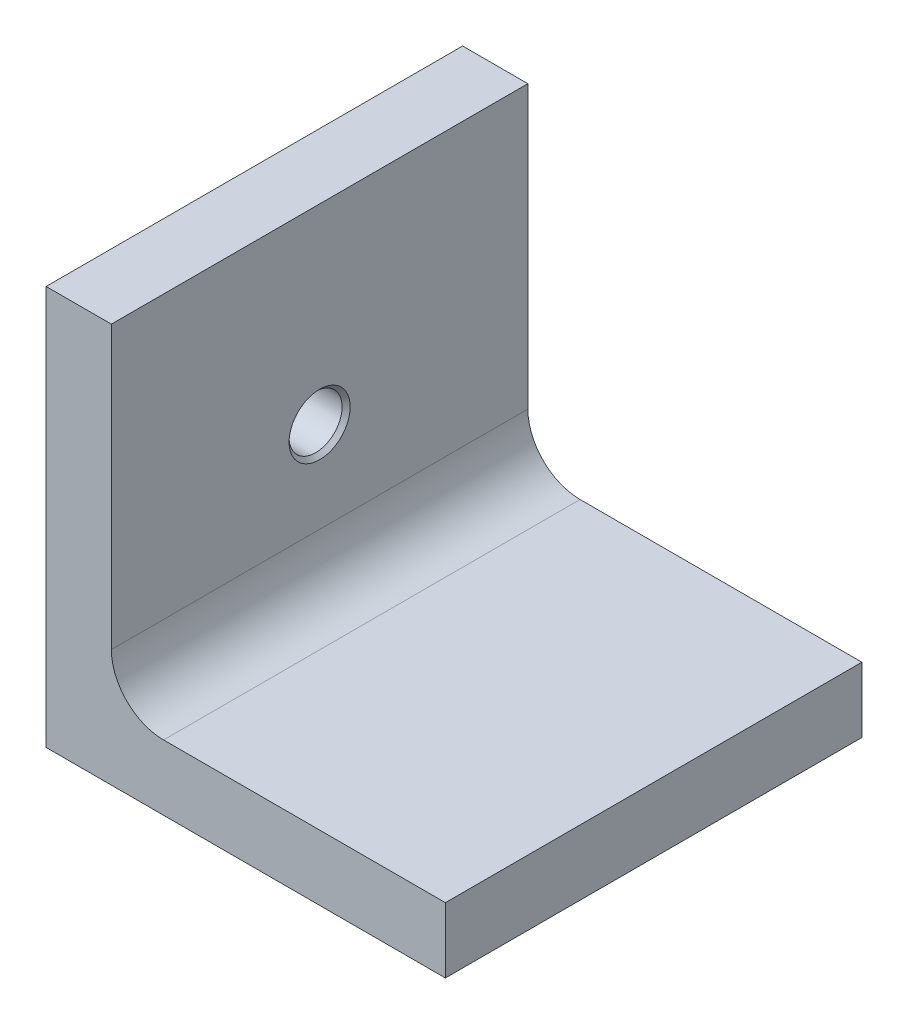
ISO-10303-21;
HEADER;
FILE_DESCRIPTION(('STEP AP214'),'2;1');
FILE_NAME('part.step','',(''),(''),'','','');
FILE_SCHEMA(('AUTOMOTIVE_DESIGN { 1 0 10303 214 1 1 1 1 }'));
ENDSEC;
DATA;
#1=APPLICATION_CONTEXT('core data for automotive mechanical design processes');
#2=APPLICATION_PROTOCOL_DEFINITION('international standard','automotive_design',2000,#1);
#3=PRODUCT_CONTEXT('',#1,'mechanical');
#4=PRODUCT('Part','Part','',(#3));
#5=PRODUCT_RELATED_PRODUCT_CATEGORY('part','',(#4));
#6=PRODUCT_DEFINITION_FORMATION('','',#4);
#7=PRODUCT_DEFINITION_CONTEXT('part definition',#1,'design');
#8=PRODUCT_DEFINITION('design','',#6,#7);
#9=PRODUCT_DEFINITION_SHAPE('','',#8);
#10=(LENGTH_UNIT() NAMED_UNIT(*) SI_UNIT(.MILLI.,.METRE.));
#11=(NAMED_UNIT(*) PLANE_ANGLE_UNIT() SI_UNIT($,.RADIAN.));
#12=(NAMED_UNIT(*) SI_UNIT($,.STERADIAN.) SOLID_ANGLE_UNIT());
#13=UNCERTAINTY_MEASURE_WITH_UNIT(LENGTH_MEASURE(1.E-05),#10,'distance_accuracy_value','');
#14=(GEOMETRIC_REPRESENTATION_CONTEXT(3) GLOBAL_UNCERTAINTY_ASSIGNED_CONTEXT((#13)) GLOBAL_UNIT_ASSIGNED_CONTEXT((#10,
#11,#12)) REPRESENTATION_CONTEXT('',''));
#15=CARTESIAN_POINT('',(0.,0.,0.));
#16=DIRECTION('',(0.,0.,1.));
#17=DIRECTION('',(1.,0.,0.));
#18=AXIS2_PLACEMENT_3D('',#15,#16,#17);
#19=CARTESIAN_POINT('',(5.969,36.5252,19.05));
#20=DIRECTION('',(0.,-1.,0.));
#21=DIRECTION('',(0.,0.,-1.));
#22=AXIS2_PLACEMENT_3D('',#19,#20,#21);
#23=PLANE('',#22);
#24=DIRECTION('',(-1.,0.,0.));
#25=VECTOR('',#24,1.);
#26=CARTESIAN_POINT('',(5.969,36.5252,-19.05));
#27=LINE('',#26,#25);
#28=CARTESIAN_POINT('',(5.969,36.5252,-19.05));
#29=VERTEX_POINT('',#28);
#30=CARTESIAN_POINT('',(0.,36.5252,-19.05));
#31=VERTEX_POINT('',#30);
#32=EDGE_CURVE('E122',#29,#31,#27,.T.);
#33=ORIENTED_EDGE('',*,*,#32,.T.);
#34=DIRECTION('',(0.,0.,-1.));
#35=VECTOR('',#34,1.);
#36=CARTESIAN_POINT('',(0.,36.5252,19.05));
#37=LINE('',#36,#35);
#38=CARTESIAN_POINT('',(0.,36.5252,19.05));
#39=VERTEX_POINT('',#38);
#40=EDGE_CURVE('E11',#39,#31,#37,.T.);
#41=ORIENTED_EDGE('',*,*,#40,.F.);
#42=DIRECTION('',(-1.,0.,0.));
#43=VECTOR('',#42,1.);
#44=CARTESIAN_POINT('',(5.969,36.5252,19.05));
#45=LINE('',#44,#43);
#46=CARTESIAN_POINT('',(5.969,36.5252,19.05));
#47=VERTEX_POINT('',#46);
#48=EDGE_CURVE('E135',#47,#39,#45,.T.);
#49=ORIENTED_EDGE('',*,*,#48,.F.);
#50=DIRECTION('',(0.,0.,-1.));
#51=VECTOR('',#50,1.);
#52=CARTESIAN_POINT('',(5.969,36.5252,19.05));
#53=LINE('',#52,#51);
#54=EDGE_CURVE('E118',#47,#29,#53,.T.);
#55=ORIENTED_EDGE('',*,*,#54,.T.);
#56=EDGE_LOOP('',(#33,#41,#49,#55));
#57=FACE_BOUND('',#56,.T.);
#58=ADVANCED_FACE('F32',(#57),#23,.F.);
#59=CARTESIAN_POINT('',(0.,36.5252,19.05));
#60=DIRECTION('',(1.,0.,0.));
#61=DIRECTION('',(0.,0.,-1.));
#62=AXIS2_PLACEMENT_3D('',#59,#60,#61);
#63=PLANE('',#62);
#64=CARTESIAN_POINT('',(0.,19.05,0.));
#65=DIRECTION('',(-1.,0.,0.));
#66=DIRECTION('',(0.,0.,1.));
#67=AXIS2_PLACEMENT_3D('',#64,#65,#66);
#68=CIRCLE('',#67,2.794);
#69=CARTESIAN_POINT('',(0.,19.05,2.794));
#70=VERTEX_POINT('',#69);
#71=EDGE_CURVE('E163',#70,#70,#68,.T.);
#72=ORIENTED_EDGE('',*,*,#71,.F.);
#73=EDGE_LOOP('',(#72));
#74=FACE_BOUND('',#73,.T.);
#75=DIRECTION('',(0.,-1.,0.));
#76=VECTOR('',#75,1.);
#77=CARTESIAN_POINT('',(0.,36.5252,-19.05));
#78=LINE('',#77,#76);
#79=CARTESIAN_POINT('',(0.,0.,-19.05));
#80=VERTEX_POINT('',#79);
#81=EDGE_CURVE('E125',#31,#80,#78,.T.);
#82=ORIENTED_EDGE('',*,*,#81,.T.);
#83=DIRECTION('',(0.,0.,-1.));
#84=VECTOR('',#83,1.);
#85=CARTESIAN_POINT('',(0.,0.,19.05));
#86=LINE('',#85,#84);
#87=CARTESIAN_POINT('',(0.,0.,19.05));
#88=VERTEX_POINT('',#87);
#89=EDGE_CURVE('E40',#88,#80,#86,.T.);
#90=ORIENTED_EDGE('',*,*,#89,.F.);
#91=DIRECTION('',(0.,-1.,0.));
#92=VECTOR('',#91,1.);
#93=CARTESIAN_POINT('',(0.,36.5252,19.05));
#94=LINE('',#93,#92);
#95=EDGE_CURVE('E88',#39,#88,#94,.T.);
#96=ORIENTED_EDGE('',*,*,#95,.F.);
#97=ORIENTED_EDGE('',*,*,#40,.T.);
#98=EDGE_LOOP('',(#82,#90,#96,#97));
#99=FACE_BOUND('',#98,.T.);
#100=ADVANCED_FACE('F190',(#74,#99),#63,.F.);
#101=CARTESIAN_POINT('',(0.,0.,19.05));
#102=DIRECTION('',(0.,1.,0.));
#103=DIRECTION('',(0.,0.,1.));
#104=AXIS2_PLACEMENT_3D('',#101,#102,#103);
#105=PLANE('',#104);
#106=DIRECTION('',(1.,0.,0.));
#107=VECTOR('',#106,1.);
#108=CARTESIAN_POINT('',(0.,0.,-19.05));
#109=LINE('',#108,#107);
#110=CARTESIAN_POINT('',(36.5252,0.,-19.05));
#111=VERTEX_POINT('',#110);
#112=EDGE_CURVE('E128',#80,#111,#109,.T.);
#113=ORIENTED_EDGE('',*,*,#112,.T.);
#114=DIRECTION('',(0.,0.,-1.));
#115=VECTOR('',#114,1.);
#116=CARTESIAN_POINT('',(36.5252,0.,19.05));
#117=LINE('',#116,#115);
#118=CARTESIAN_POINT('',(36.5252,0.,19.05));
#119=VERTEX_POINT('',#118);
#120=EDGE_CURVE('E139',#119,#111,#117,.T.);
#121=ORIENTED_EDGE('',*,*,#120,.F.);
#122=DIRECTION('',(1.,0.,0.));
#123=VECTOR('',#122,1.);
#124=CARTESIAN_POINT('',(0.,0.,19.05));
#125=LINE('',#124,#123);
#126=EDGE_CURVE('E147',#88,#119,#125,.T.);
#127=ORIENTED_EDGE('',*,*,#126,.F.);
#128=ORIENTED_EDGE('',*,*,#89,.T.);
#129=EDGE_LOOP('',(#113,#121,#127,#128));
#130=FACE_BOUND('',#129,.T.);
#131=ADVANCED_FACE('F145',(#130),#105,.F.);
#132=CARTESIAN_POINT('',(36.5252,0.,19.05));
#133=DIRECTION('',(-1.,0.,0.));
#134=DIRECTION('',(0.,0.,1.));
#135=AXIS2_PLACEMENT_3D('',#132,#133,#134);
#136=PLANE('',#135);
#137=DIRECTION('',(0.,1.,0.));
#138=VECTOR('',#137,1.);
#139=CARTESIAN_POINT('',(36.5252,0.,-19.05));
#140=LINE('',#139,#138);
#141=CARTESIAN_POINT('',(36.5252,5.96899999999999,-19.05));
#142=VERTEX_POINT('',#141);
#143=EDGE_CURVE('E130',#111,#142,#140,.T.);
#144=ORIENTED_EDGE('',*,*,#143,.T.);
#145=DIRECTION('',(0.,0.,-1.));
#146=VECTOR('',#145,1.);
#147=CARTESIAN_POINT('',(36.5252,5.96899999999999,19.05));
#148=LINE('',#147,#146);
#149=CARTESIAN_POINT('',(36.5252,5.96899999999999,19.05));
#150=VERTEX_POINT('',#149);
#151=EDGE_CURVE('E113',#150,#142,#148,.T.);
#152=ORIENTED_EDGE('',*,*,#151,.F.);
#153=DIRECTION('',(0.,1.,0.));
#154=VECTOR('',#153,1.);
#155=CARTESIAN_POINT('',(36.5252,0.,19.05));
#156=LINE('',#155,#154);
#157=EDGE_CURVE('E104',#119,#150,#156,.T.);
#158=ORIENTED_EDGE('',*,*,#157,.F.);
#159=ORIENTED_EDGE('',*,*,#120,.T.);
#160=EDGE_LOOP('',(#144,#152,#158,#159));
#161=FACE_BOUND('',#160,.T.);
#162=ADVANCED_FACE('F153',(#161),#136,.F.);
#163=CARTESIAN_POINT('',(36.5252,5.96899999999999,19.05));
#164=DIRECTION('',(0.,-1.,0.));
#165=DIRECTION('',(1.,0.,0.));
#166=AXIS2_PLACEMENT_3D('',#163,#164,#165);
#167=PLANE('',#166);
#168=DIRECTION('',(-1.,0.,0.));
#169=VECTOR('',#168,1.);
#170=CARTESIAN_POINT('',(36.5252,5.96899999999999,-19.05));
#171=LINE('',#170,#169);
#172=CARTESIAN_POINT('',(10.7442,5.969,-19.05));
#173=VERTEX_POINT('',#172);
#174=EDGE_CURVE('E112',#142,#173,#171,.T.);
#175=ORIENTED_EDGE('',*,*,#174,.T.);
#176=DIRECTION('',(0.,0.,-1.));
#177=VECTOR('',#176,1.);
#178=CARTESIAN_POINT('',(10.7442,5.969,19.05));
#179=LINE('',#178,#177);
#180=CARTESIAN_POINT('',(10.7442,5.969,19.05));
#181=VERTEX_POINT('',#180);
#182=EDGE_CURVE('E109',#181,#173,#179,.T.);
#183=ORIENTED_EDGE('',*,*,#182,.F.);
#184=DIRECTION('',(-1.,0.,0.));
#185=VECTOR('',#184,1.);
#186=CARTESIAN_POINT('',(36.5252,5.96899999999999,19.05));
#187=LINE('',#186,#185);
#188=EDGE_CURVE('E98',#150,#181,#187,.T.);
#189=ORIENTED_EDGE('',*,*,#188,.F.);
#190=ORIENTED_EDGE('',*,*,#151,.T.);
#191=EDGE_LOOP('',(#175,#183,#189,#190));
#192=FACE_BOUND('',#191,.T.);
#193=ADVANCED_FACE('F110',(#192),#167,.F.);
#194=CARTESIAN_POINT('',(10.7442,10.7442,19.05));
#195=DIRECTION('',(0.,0.,-1.));
#196=DIRECTION('',(-1.,0.,0.));
#197=AXIS2_PLACEMENT_3D('',#194,#195,#196);
#198=CYLINDRICAL_SURFACE('',#197,4.7752);
#199=CARTESIAN_POINT('',(10.7442,10.7442,-19.05));
#200=DIRECTION('',(0.,0.,-1.));
#201=DIRECTION('',(-1.,0.,0.));
#202=AXIS2_PLACEMENT_3D('',#199,#200,#201);
#203=CIRCLE('',#202,4.7752);
#204=CARTESIAN_POINT('',(5.969,10.7442,-19.05));
#205=VERTEX_POINT('',#204);
#206=EDGE_CURVE('E74',#173,#205,#203,.T.);
#207=ORIENTED_EDGE('',*,*,#206,.T.);
#208=DIRECTION('',(0.,0.,-1.));
#209=VECTOR('',#208,1.);
#210=CARTESIAN_POINT('',(5.969,10.7442,19.05));
#211=LINE('',#210,#209);
#212=CARTESIAN_POINT('',(5.969,10.7442,19.05));
#213=VERTEX_POINT('',#212);
#214=EDGE_CURVE('E114',#213,#205,#211,.T.);
#215=ORIENTED_EDGE('',*,*,#214,.F.);
#216=CARTESIAN_POINT('',(10.7442,10.7442,19.05));
#217=DIRECTION('',(0.,0.,-1.));
#218=DIRECTION('',(-1.,0.,0.));
#219=AXIS2_PLACEMENT_3D('',#216,#217,#218);
#220=CIRCLE('',#219,4.7752);
#221=EDGE_CURVE('E102',#181,#213,#220,.T.);
#222=ORIENTED_EDGE('',*,*,#221,.F.);
#223=ORIENTED_EDGE('',*,*,#182,.T.);
#224=EDGE_LOOP('',(#207,#215,#222,#223));
#225=FACE_BOUND('',#224,.T.);
#226=ADVANCED_FACE('F116',(#225),#198,.F.);
#227=CARTESIAN_POINT('',(5.969,10.7442,19.05));
#228=DIRECTION('',(-1.,0.,0.));
#229=DIRECTION('',(0.,0.,1.));
#230=AXIS2_PLACEMENT_3D('',#227,#228,#229);
#231=PLANE('',#230);
#232=CARTESIAN_POINT('',(5.969,19.05,0.));
#233=DIRECTION('',(-1.,0.,0.));
#234=DIRECTION('',(0.,0.,1.));
#235=AXIS2_PLACEMENT_3D('',#232,#233,#234);
#236=CIRCLE('',#235,2.794);
#237=CARTESIAN_POINT('',(5.969,19.05,2.794));
#238=VERTEX_POINT('',#237);
#239=EDGE_CURVE('E166',#238,#238,#236,.T.);
#240=ORIENTED_EDGE('',*,*,#239,.T.);
#241=EDGE_LOOP('',(#240));
#242=FACE_BOUND('',#241,.T.);
#243=DIRECTION('',(0.,1.,0.));
#244=VECTOR('',#243,1.);
#245=CARTESIAN_POINT('',(5.969,10.7442,-19.05));
#246=LINE('',#245,#244);
#247=EDGE_CURVE('E80',#205,#29,#246,.T.);
#248=ORIENTED_EDGE('',*,*,#247,.T.);
#249=ORIENTED_EDGE('',*,*,#54,.F.);
#250=DIRECTION('',(0.,1.,0.));
#251=VECTOR('',#250,1.);
#252=CARTESIAN_POINT('',(5.969,10.7442,19.05));
#253=LINE('',#252,#251);
#254=EDGE_CURVE('E48',#213,#47,#253,.T.);
#255=ORIENTED_EDGE('',*,*,#254,.F.);
#256=ORIENTED_EDGE('',*,*,#214,.T.);
#257=EDGE_LOOP('',(#248,#249,#255,#256));
#258=FACE_BOUND('',#257,.T.);
#259=ADVANCED_FACE('F170',(#242,#258),#231,.F.);
#260=CARTESIAN_POINT('',(10.7442,10.7442,19.05));
#261=DIRECTION('',(0.,0.,-1.));
#262=DIRECTION('',(-1.,0.,0.));
#263=AXIS2_PLACEMENT_3D('',#260,#261,#262);
#264=PLANE('',#263);
#265=ORIENTED_EDGE('',*,*,#48,.T.);
#266=ORIENTED_EDGE('',*,*,#95,.T.);
#267=ORIENTED_EDGE('',*,*,#126,.T.);
#268=ORIENTED_EDGE('',*,*,#157,.T.);
#269=ORIENTED_EDGE('',*,*,#188,.T.);
#270=ORIENTED_EDGE('',*,*,#221,.T.);
#271=ORIENTED_EDGE('',*,*,#254,.T.);
#272=EDGE_LOOP('',(#265,#266,#267,#268,#269,#270,#271));
#273=FACE_BOUND('',#272,.T.);
#274=ADVANCED_FACE('F100',(#273),#264,.F.);
#275=CARTESIAN_POINT('',(10.7442,10.7442,-19.05));
#276=DIRECTION('',(0.,0.,-1.));
#277=DIRECTION('',(-1.,0.,0.));
#278=AXIS2_PLACEMENT_3D('',#275,#276,#277);
#279=PLANE('',#278);
#280=ORIENTED_EDGE('',*,*,#32,.F.);
#281=ORIENTED_EDGE('',*,*,#247,.F.);
#282=ORIENTED_EDGE('',*,*,#206,.F.);
#283=ORIENTED_EDGE('',*,*,#174,.F.);
#284=ORIENTED_EDGE('',*,*,#143,.F.);
#285=ORIENTED_EDGE('',*,*,#112,.F.);
#286=ORIENTED_EDGE('',*,*,#81,.F.);
#287=EDGE_LOOP('',(#280,#281,#282,#283,#284,#285,#286));
#288=FACE_BOUND('',#287,.T.);
#289=ADVANCED_FACE('F151',(#288),#279,.T.);
#290=CARTESIAN_POINT('',(5.6007,19.05,0.));
#291=DIRECTION('',(1.,0.,0.));
#292=DIRECTION('',(0.,0.,-1.));
#293=AXIS2_PLACEMENT_3D('',#290,#291,#292);
#294=CONICAL_SURFACE('',#293,2.4257,0.785398163397444);
#295=ORIENTED_EDGE('',*,*,#239,.F.);
#296=EDGE_LOOP('',(#295));
#297=FACE_BOUND('',#296,.T.);
#298=CARTESIAN_POINT('',(5.6007,19.05,0.));
#299=DIRECTION('',(-1.,0.,0.));
#300=DIRECTION('',(0.,0.,1.));
#301=AXIS2_PLACEMENT_3D('',#298,#299,#300);
#302=CIRCLE('',#301,2.4257);
#303=CARTESIAN_POINT('',(5.6007,19.05,2.4257));
#304=VERTEX_POINT('',#303);
#305=EDGE_CURVE('E126',#304,#304,#302,.T.);
#306=ORIENTED_EDGE('',*,*,#305,.T.);
#307=EDGE_LOOP('',(#306));
#308=FACE_BOUND('',#307,.T.);
#309=ADVANCED_FACE('F172',(#297,#308),#294,.F.);
#310=CARTESIAN_POINT('',(0.,19.05,0.));
#311=DIRECTION('',(-1.,0.,0.));
#312=DIRECTION('',(0.,0.,1.));
#313=AXIS2_PLACEMENT_3D('',#310,#311,#312);
#314=CYLINDRICAL_SURFACE('',#313,2.4257);
#315=ORIENTED_EDGE('',*,*,#305,.F.);
#316=EDGE_LOOP('',(#315));
#317=FACE_BOUND('',#316,.T.);
#318=CARTESIAN_POINT('',(0.368299999999998,19.05,0.));
#319=DIRECTION('',(-1.,0.,0.));
#320=DIRECTION('',(0.,0.,1.));
#321=AXIS2_PLACEMENT_3D('',#318,#319,#320);
#322=CIRCLE('',#321,2.4257);
#323=CARTESIAN_POINT('',(0.368299999999998,19.05,2.4257));
#324=VERTEX_POINT('',#323);
#325=EDGE_CURVE('E160',#324,#324,#322,.T.);
#326=ORIENTED_EDGE('',*,*,#325,.T.);
#327=EDGE_LOOP('',(#326));
#328=FACE_BOUND('',#327,.T.);
#329=ADVANCED_FACE('F175',(#317,#328),#314,.F.);
#330=CARTESIAN_POINT('',(0.,19.05,0.));
#331=DIRECTION('',(-1.,0.,0.));
#332=DIRECTION('',(0.,0.,1.));
#333=AXIS2_PLACEMENT_3D('',#330,#331,#332);
#334=CONICAL_SURFACE('',#333,2.794,0.785398163397454);
#335=ORIENTED_EDGE('',*,*,#325,.F.);
#336=EDGE_LOOP('',(#335));
#337=FACE_BOUND('',#336,.T.);
#338=ORIENTED_EDGE('',*,*,#71,.T.);
#339=EDGE_LOOP('',(#338));
#340=FACE_BOUND('',#339,.T.);
#341=ADVANCED_FACE('F181',(#337,#340),#334,.F.);
#342=CLOSED_SHELL('',(#58,#100,#131,#162,#193,#226,#259,#274,#289,#309,#329,#341));
#343=MANIFOLD_SOLID_BREP('B2',#342);
#344=ADVANCED_BREP_SHAPE_REPRESENTATION('',(#18,#343),#14);
#345=SHAPE_DEFINITION_REPRESENTATION(#9,#344);
ENDSEC;
END-ISO-10303-21;
